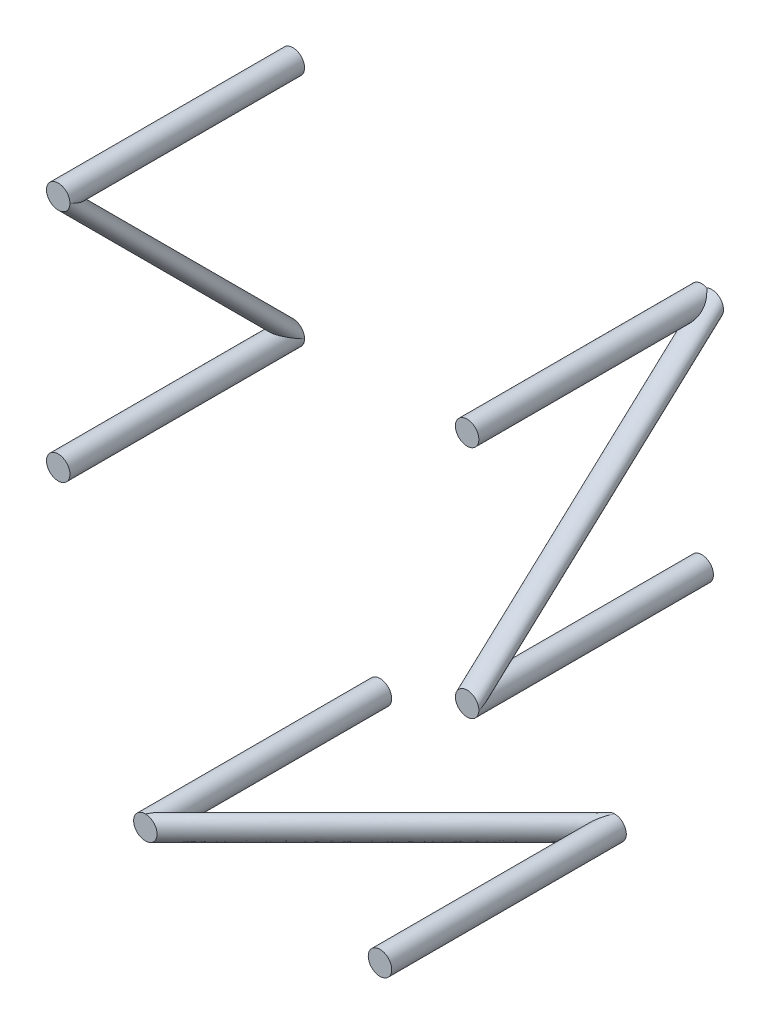
ISO-10303-21;
HEADER;
FILE_DESCRIPTION(('STEP AP214'),'2;1');
FILE_NAME('part.step','',(''),(''),'','','');
FILE_SCHEMA(('AUTOMOTIVE_DESIGN { 1 0 10303 214 1 1 1 1 }'));
ENDSEC;
DATA;
#1=APPLICATION_CONTEXT('core data for automotive mechanical design processes');
#2=APPLICATION_PROTOCOL_DEFINITION('international standard','automotive_design',2000,#1);
#3=PRODUCT_CONTEXT('',#1,'mechanical');
#4=PRODUCT('Part','Part','',(#3));
#5=PRODUCT_RELATED_PRODUCT_CATEGORY('part','',(#4));
#6=PRODUCT_DEFINITION_FORMATION('','',#4);
#7=PRODUCT_DEFINITION_CONTEXT('part definition',#1,'design');
#8=PRODUCT_DEFINITION('design','',#6,#7);
#9=PRODUCT_DEFINITION_SHAPE('','',#8);
#10=(LENGTH_UNIT() NAMED_UNIT(*) SI_UNIT(.MILLI.,.METRE.));
#11=(NAMED_UNIT(*) PLANE_ANGLE_UNIT() SI_UNIT($,.RADIAN.));
#12=(NAMED_UNIT(*) SI_UNIT($,.STERADIAN.) SOLID_ANGLE_UNIT());
#13=UNCERTAINTY_MEASURE_WITH_UNIT(LENGTH_MEASURE(1.E-05),#10,'distance_accuracy_value','');
#14=(GEOMETRIC_REPRESENTATION_CONTEXT(3) GLOBAL_UNCERTAINTY_ASSIGNED_CONTEXT((#13)) GLOBAL_UNIT_ASSIGNED_CONTEXT((#10,
#11,#12)) REPRESENTATION_CONTEXT('',''));
#15=CARTESIAN_POINT('',(0.,0.,0.));
#16=DIRECTION('',(0.,0.,1.));
#17=DIRECTION('',(1.,0.,0.));
#18=AXIS2_PLACEMENT_3D('',#15,#16,#17);
#19=CARTESIAN_POINT('',(61.,-35.,35.));
#20=DIRECTION('',(0.,0.,1.));
#21=DIRECTION('',(1.,0.,0.));
#22=AXIS2_PLACEMENT_3D('',#19,#20,#21);
#23=PLANE('',#22);
#24=CARTESIAN_POINT('',(61.,-35.,35.));
#25=DIRECTION('',(0.,0.,1.));
#26=DIRECTION('',(1.,0.,0.));
#27=AXIS2_PLACEMENT_3D('',#24,#25,#26);
#28=CIRCLE('',#27,3.50000000000001);
#29=CARTESIAN_POINT('',(64.5,-35.,35.));
#30=VERTEX_POINT('',#29);
#31=EDGE_CURVE('E50',#30,#30,#28,.T.);
#32=ORIENTED_EDGE('',*,*,#31,.T.);
#33=EDGE_LOOP('',(#32));
#34=FACE_BOUND('',#33,.T.);
#35=ADVANCED_FACE('F44',(#34),#23,.T.);
#36=CARTESIAN_POINT('',(64.0000000000002,35.,-35.));
#37=DIRECTION('',(0.,0.,1.));
#38=DIRECTION('',(1.,0.,0.));
#39=AXIS2_PLACEMENT_3D('',#36,#37,#38);
#40=PLANE('',#39);
#41=CARTESIAN_POINT('',(64.0000000000002,35.,-35.));
#42=DIRECTION('',(0.,0.,1.));
#43=DIRECTION('',(1.,0.,0.));
#44=AXIS2_PLACEMENT_3D('',#41,#42,#43);
#45=CIRCLE('',#44,3.50000000000001);
#46=CARTESIAN_POINT('',(67.5000000000002,35.,-35.));
#47=VERTEX_POINT('',#46);
#48=EDGE_CURVE('E11',#47,#47,#45,.T.);
#49=ORIENTED_EDGE('',*,*,#48,.F.);
#50=EDGE_LOOP('',(#49));
#51=FACE_BOUND('',#50,.T.);
#52=ADVANCED_FACE('F59',(#51),#40,.F.);
#53=CARTESIAN_POINT('',(64.5,-35.,35.));
#54=CARTESIAN_POINT('',(67.5000000000002,35.,-35.));
#55=CARTESIAN_POINT('',(64.5,-28.,35.));
#56=CARTESIAN_POINT('',(67.5000000000002,42.,-35.));
#57=CARTESIAN_POINT('',(57.5,-28.,35.));
#58=CARTESIAN_POINT('',(60.5000000000002,42.,-35.));
#59=CARTESIAN_POINT('',(57.5,-35.,35.));
#60=CARTESIAN_POINT('',(60.5000000000002,35.,-35.));
#61=CARTESIAN_POINT('',(57.5,-42.,35.));
#62=CARTESIAN_POINT('',(60.5000000000002,28.,-35.));
#63=CARTESIAN_POINT('',(64.5,-42.,35.));
#64=CARTESIAN_POINT('',(67.5000000000002,28.,-35.));
#65=CARTESIAN_POINT('',(64.5,-35.,35.));
#66=CARTESIAN_POINT('',(67.5000000000002,35.,-35.));
#67=(BOUNDED_SURFACE() B_SPLINE_SURFACE(3,1,((#53,#54),(#55,#56),(#57,#58),(#59,#60),(#61,#62),
(#63,#64),(#65,#66)),.UNSPECIFIED.,.T.,.F.,.F.) B_SPLINE_SURFACE_WITH_KNOTS((4,3,4),(2,2),(0.,
0.5,1.),(0.,1.),.UNSPECIFIED.) GEOMETRIC_REPRESENTATION_ITEM() RATIONAL_B_SPLINE_SURFACE(((1.,
1.),(0.333333333333333,0.333333333333333),(0.333333333333333,0.333333333333333),(1.,1.),
(0.333333333333333,0.333333333333333),(0.333333333333333,0.333333333333333),(1.,1.))) REPRESENTATION_ITEM('') SURFACE());
#68=CARTESIAN_POINT('',(67.5000000000002,35.,-35.));
#69=CARTESIAN_POINT('',(67.4687500000002,34.2708333333334,-34.2708333333333));
#70=CARTESIAN_POINT('',(67.4375000000002,33.5416666666667,-33.5416666666667));
#71=CARTESIAN_POINT('',(67.3750000000002,32.0833333333334,-32.0833333333333));
#72=CARTESIAN_POINT('',(67.3437500000002,31.3541666666667,-31.3541666666667));
#73=CARTESIAN_POINT('',(67.2812500000002,29.8958333333334,-29.8958333333333));
#74=CARTESIAN_POINT('',(67.2500000000002,29.1666666666667,-29.1666666666667));
#75=CARTESIAN_POINT('',(67.1875000000002,27.7083333333334,-27.7083333333333));
#76=CARTESIAN_POINT('',(67.1562500000002,26.9791666666667,-26.9791666666667));
#77=CARTESIAN_POINT('',(67.0937500000002,25.5208333333334,-25.5208333333333));
#78=CARTESIAN_POINT('',(67.0625000000002,24.7916666666667,-24.7916666666667));
#79=CARTESIAN_POINT('',(67.0000000000002,23.3333333333334,-23.3333333333333));
#80=CARTESIAN_POINT('',(66.9687500000002,22.6041666666667,-22.6041666666667));
#81=CARTESIAN_POINT('',(66.9062500000002,21.1458333333333,-21.1458333333333));
#82=CARTESIAN_POINT('',(66.8750000000002,20.4166666666667,-20.4166666666667));
#83=CARTESIAN_POINT('',(66.8125000000002,18.9583333333333,-18.9583333333333));
#84=CARTESIAN_POINT('',(66.7812500000002,18.2291666666667,-18.2291666666667));
#85=CARTESIAN_POINT('',(66.7187500000002,16.7708333333333,-16.7708333333333));
#86=CARTESIAN_POINT('',(66.6875000000002,16.0416666666667,-16.0416666666667));
#87=CARTESIAN_POINT('',(66.6250000000002,14.5833333333333,-14.5833333333333));
#88=CARTESIAN_POINT('',(66.5937500000002,13.8541666666667,-13.8541666666667));
#89=CARTESIAN_POINT('',(66.5312500000002,12.3958333333333,-12.3958333333333));
#90=CARTESIAN_POINT('',(66.5000000000002,11.6666666666667,-11.6666666666667));
#91=CARTESIAN_POINT('',(66.4375000000002,10.2083333333333,-10.2083333333333));
#92=CARTESIAN_POINT('',(66.4062500000002,9.47916666666667,-9.47916666666667));
#93=CARTESIAN_POINT('',(66.3437500000001,8.02083333333334,-8.02083333333333));
#94=CARTESIAN_POINT('',(66.3125000000001,7.29166666666667,-7.29166666666667));
#95=CARTESIAN_POINT('',(66.2500000000001,5.83333333333334,-5.83333333333333));
#96=CARTESIAN_POINT('',(66.2187500000001,5.10416666666667,-5.10416666666667));
#97=CARTESIAN_POINT('',(66.1562500000001,3.64583333333334,-3.64583333333334));
#98=CARTESIAN_POINT('',(66.1250000000001,2.91666666666667,-2.91666666666667));
#99=CARTESIAN_POINT('',(66.0625000000001,1.45833333333333,-1.45833333333333));
#100=CARTESIAN_POINT('',(66.0312500000001,0.729166666666667,-0.729166666666667));
#101=CARTESIAN_POINT('',(65.9687500000001,-0.729166666666667,0.729166666666667));
#102=CARTESIAN_POINT('',(65.9375000000001,-1.45833333333333,1.45833333333333));
#103=CARTESIAN_POINT('',(65.8750000000001,-2.91666666666667,2.91666666666667));
#104=CARTESIAN_POINT('',(65.8437500000001,-3.64583333333334,3.64583333333334));
#105=CARTESIAN_POINT('',(65.7812500000001,-5.10416666666667,5.10416666666667));
#106=CARTESIAN_POINT('',(65.7500000000001,-5.83333333333334,5.83333333333333));
#107=CARTESIAN_POINT('',(65.6875000000001,-7.29166666666667,7.29166666666667));
#108=CARTESIAN_POINT('',(65.6562500000001,-8.02083333333334,8.02083333333333));
#109=CARTESIAN_POINT('',(65.5937500000001,-9.47916666666667,9.47916666666667));
#110=CARTESIAN_POINT('',(65.5625000000001,-10.2083333333333,10.2083333333333));
#111=CARTESIAN_POINT('',(65.5000000000001,-11.6666666666667,11.6666666666667));
#112=CARTESIAN_POINT('',(65.4687500000001,-12.3958333333333,12.3958333333333));
#113=CARTESIAN_POINT('',(65.4062500000001,-13.8541666666667,13.8541666666667));
#114=CARTESIAN_POINT('',(65.3750000000001,-14.5833333333333,14.5833333333333));
#115=CARTESIAN_POINT('',(65.3125000000001,-16.0416666666667,16.0416666666667));
#116=CARTESIAN_POINT('',(65.2812500000001,-16.7708333333333,16.7708333333333));
#117=CARTESIAN_POINT('',(65.2187500000001,-18.2291666666667,18.2291666666667));
#118=CARTESIAN_POINT('',(65.1875000000001,-18.9583333333333,18.9583333333333));
#119=CARTESIAN_POINT('',(65.1250000000001,-20.4166666666667,20.4166666666667));
#120=CARTESIAN_POINT('',(65.0937500000001,-21.1458333333333,21.1458333333333));
#121=CARTESIAN_POINT('',(65.03125,-22.6041666666667,22.6041666666667));
#122=CARTESIAN_POINT('',(65.,-23.3333333333334,23.3333333333333));
#123=CARTESIAN_POINT('',(64.9375,-24.7916666666667,24.7916666666667));
#124=CARTESIAN_POINT('',(64.90625,-25.5208333333334,25.5208333333333));
#125=CARTESIAN_POINT('',(64.84375,-26.9791666666667,26.9791666666667));
#126=CARTESIAN_POINT('',(64.8125,-27.7083333333334,27.7083333333333));
#127=CARTESIAN_POINT('',(64.75,-29.1666666666667,29.1666666666667));
#128=CARTESIAN_POINT('',(64.71875,-29.8958333333334,29.8958333333333));
#129=CARTESIAN_POINT('',(64.65625,-31.3541666666667,31.3541666666667));
#130=CARTESIAN_POINT('',(64.625,-32.0833333333334,32.0833333333333));
#131=CARTESIAN_POINT('',(64.5625,-33.5416666666667,33.5416666666667));
#132=CARTESIAN_POINT('',(64.53125,-34.2708333333334,34.2708333333333));
#133=CARTESIAN_POINT('',(64.5,-35.,35.));
#134=B_SPLINE_CURVE_WITH_KNOTS('',3,(#68,#69,#70,#71,#72,#73,#74,#75,#76,#77,#78,#79,#80,#81,
#82,#83,#84,#85,#86,#87,#88,#89,#90,#91,#92,#93,#94,#95,#96,#97,#98,#99,#100,#101,#102,#103,
#104,#105,#106,#107,#108,#109,#110,#111,#112,#113,#114,#115,#116,#117,#118,#119,#120,#121,#122,
#123,#124,#125,#126,#127,#128,#129,#130,#131,#132,#133),.UNSPECIFIED.,.F.,.F.,(4,2,2,2,2,2,2,2,
2,2,2,2,2,2,2,2,2,2,2,2,2,2,2,2,2,2,2,2,2,2,2,2,4),(0.,3.09501236871519,6.19002473743038,
9.28503710614557,12.3800494748608,15.475061843576,18.5700742122911,21.6650865810063,
24.7600989497215,27.8551113184367,30.9501236871519,34.0451360558671,37.1401484245823,
40.2351607932975,43.3301731620127,46.4251855307278,49.520197899443,52.6152102681582,
55.7102226368734,58.8052350055886,61.9002473743038,64.995259743019,68.0902721117342,
71.1852844804494,74.2802968491646,77.3753092178797,80.4703215865949,83.5653339553101,
86.6603463240253,89.7553586927405,92.8503710614557,95.9453834301709,99.0403957988861),.UNSPECIFIED.);
#135=EDGE_CURVE('BSEAM57',#47,#30,#134,.T.);
#136=ORIENTED_EDGE('',*,*,#48,.T.);
#137=ORIENTED_EDGE('',*,*,#31,.F.);
#138=ORIENTED_EDGE('',*,*,#135,.T.);
#139=ORIENTED_EDGE('',*,*,#135,.F.);
#140=EDGE_LOOP('',(#136,#138,#137,#139));
#141=FACE_BOUND('',#140,.T.);
#142=ADVANCED_FACE('F57',(#141),#67,.F.);
#143=CLOSED_SHELL('',(#35,#52,#142));
#144=MANIFOLD_SOLID_BREP('B2',#143);
#145=CARTESIAN_POINT('',(-61.,35.,35.));
#146=DIRECTION('',(0.,0.,1.));
#147=DIRECTION('',(1.,0.,0.));
#148=AXIS2_PLACEMENT_3D('',#145,#146,#147);
#149=PLANE('',#148);
#150=CARTESIAN_POINT('',(-61.,35.,35.));
#151=DIRECTION('',(0.,0.,1.));
#152=DIRECTION('',(1.,0.,0.));
#153=AXIS2_PLACEMENT_3D('',#150,#151,#152);
#154=CIRCLE('',#153,3.5);
#155=CARTESIAN_POINT('',(-57.5,35.,35.));
#156=VERTEX_POINT('',#155);
#157=EDGE_CURVE('E106',#156,#156,#154,.T.);
#158=ORIENTED_EDGE('',*,*,#157,.T.);
#159=EDGE_LOOP('',(#158));
#160=FACE_BOUND('',#159,.T.);
#161=ADVANCED_FACE('F100',(#160),#149,.T.);
#162=CARTESIAN_POINT('',(-61.,-35.,-35.));
#163=DIRECTION('',(0.,0.,1.));
#164=DIRECTION('',(1.,0.,0.));
#165=AXIS2_PLACEMENT_3D('',#162,#163,#164);
#166=PLANE('',#165);
#167=CARTESIAN_POINT('',(-61.,-35.,-35.));
#168=DIRECTION('',(0.,0.,1.));
#169=DIRECTION('',(1.,0.,0.));
#170=AXIS2_PLACEMENT_3D('',#167,#168,#169);
#171=CIRCLE('',#170,3.5);
#172=CARTESIAN_POINT('',(-57.5,-35.,-35.));
#173=VERTEX_POINT('',#172);
#174=EDGE_CURVE('E43',#173,#173,#171,.T.);
#175=ORIENTED_EDGE('',*,*,#174,.F.);
#176=EDGE_LOOP('',(#175));
#177=FACE_BOUND('',#176,.T.);
#178=ADVANCED_FACE('F115',(#177),#166,.F.);
#179=CARTESIAN_POINT('',(-57.5,35.,35.));
#180=CARTESIAN_POINT('',(-57.5,-35.,-35.));
#181=CARTESIAN_POINT('',(-57.5,42.,35.));
#182=CARTESIAN_POINT('',(-57.5,-28.,-35.));
#183=CARTESIAN_POINT('',(-64.5,42.,35.));
#184=CARTESIAN_POINT('',(-64.5,-28.,-35.));
#185=CARTESIAN_POINT('',(-64.5,35.,35.));
#186=CARTESIAN_POINT('',(-64.5,-35.,-35.));
#187=CARTESIAN_POINT('',(-64.5,28.,35.));
#188=CARTESIAN_POINT('',(-64.5,-42.,-35.));
#189=CARTESIAN_POINT('',(-57.5,28.,35.));
#190=CARTESIAN_POINT('',(-57.5,-42.,-35.));
#191=CARTESIAN_POINT('',(-57.5,35.,35.));
#192=CARTESIAN_POINT('',(-57.5,-35.,-35.));
#193=(BOUNDED_SURFACE() B_SPLINE_SURFACE(3,1,((#179,#180),(#181,#182),(#183,#184),(#185,#186),
(#187,#188),(#189,#190),(#191,#192)),.UNSPECIFIED.,.T.,.F.,.F.) B_SPLINE_SURFACE_WITH_KNOTS((4,
3,4),(2,2),(0.,0.5,1.),(0.,1.),
.UNSPECIFIED.) GEOMETRIC_REPRESENTATION_ITEM() RATIONAL_B_SPLINE_SURFACE(((1.,1.),
(0.333333333333333,0.333333333333333),(0.333333333333333,0.333333333333333),(1.,1.),
(0.333333333333333,0.333333333333333),(0.333333333333333,0.333333333333333),(1.,1.))) REPRESENTATION_ITEM('') SURFACE());
#194=CARTESIAN_POINT('',(-57.5,-35.,-35.));
#195=CARTESIAN_POINT('',(-57.5,-34.2708333333334,-34.2708333333333));
#196=CARTESIAN_POINT('',(-57.5,-33.5416666666667,-33.5416666666667));
#197=CARTESIAN_POINT('',(-57.5,-32.0833333333333,-32.0833333333333));
#198=CARTESIAN_POINT('',(-57.5,-31.3541666666667,-31.3541666666667));
#199=CARTESIAN_POINT('',(-57.5,-29.8958333333333,-29.8958333333333));
#200=CARTESIAN_POINT('',(-57.5,-29.1666666666667,-29.1666666666667));
#201=CARTESIAN_POINT('',(-57.5,-27.7083333333333,-27.7083333333333));
#202=CARTESIAN_POINT('',(-57.5,-26.9791666666667,-26.9791666666667));
#203=CARTESIAN_POINT('',(-57.5,-25.5208333333333,-25.5208333333333));
#204=CARTESIAN_POINT('',(-57.5,-24.7916666666667,-24.7916666666667));
#205=CARTESIAN_POINT('',(-57.5,-23.3333333333333,-23.3333333333333));
#206=CARTESIAN_POINT('',(-57.5,-22.6041666666667,-22.6041666666667));
#207=CARTESIAN_POINT('',(-57.5,-21.1458333333333,-21.1458333333333));
#208=CARTESIAN_POINT('',(-57.5,-20.4166666666667,-20.4166666666667));
#209=CARTESIAN_POINT('',(-57.5,-18.9583333333333,-18.9583333333333));
#210=CARTESIAN_POINT('',(-57.5,-18.2291666666667,-18.2291666666667));
#211=CARTESIAN_POINT('',(-57.5,-16.7708333333333,-16.7708333333333));
#212=CARTESIAN_POINT('',(-57.5,-16.0416666666667,-16.0416666666667));
#213=CARTESIAN_POINT('',(-57.5,-14.5833333333333,-14.5833333333333));
#214=CARTESIAN_POINT('',(-57.5,-13.8541666666667,-13.8541666666667));
#215=CARTESIAN_POINT('',(-57.5,-12.3958333333333,-12.3958333333333));
#216=CARTESIAN_POINT('',(-57.5,-11.6666666666667,-11.6666666666667));
#217=CARTESIAN_POINT('',(-57.5,-10.2083333333333,-10.2083333333333));
#218=CARTESIAN_POINT('',(-57.5,-9.47916666666667,-9.47916666666666));
#219=CARTESIAN_POINT('',(-57.5,-8.02083333333333,-8.02083333333333));
#220=CARTESIAN_POINT('',(-57.5,-7.29166666666667,-7.29166666666666));
#221=CARTESIAN_POINT('',(-57.5,-5.83333333333333,-5.83333333333333));
#222=CARTESIAN_POINT('',(-57.5,-5.10416666666667,-5.10416666666666));
#223=CARTESIAN_POINT('',(-57.5,-3.64583333333333,-3.64583333333333));
#224=CARTESIAN_POINT('',(-57.5,-2.91666666666666,-2.91666666666666));
#225=CARTESIAN_POINT('',(-57.5,-1.45833333333333,-1.45833333333333));
#226=CARTESIAN_POINT('',(-57.5,-0.72916666666666,-0.729166666666661));
#227=CARTESIAN_POINT('',(-57.5,0.729166666666674,0.729166666666675));
#228=CARTESIAN_POINT('',(-57.5,1.45833333333334,1.45833333333334));
#229=CARTESIAN_POINT('',(-57.5,2.91666666666668,2.91666666666667));
#230=CARTESIAN_POINT('',(-57.5,3.64583333333334,3.64583333333334));
#231=CARTESIAN_POINT('',(-57.5,5.10416666666668,5.10416666666667));
#232=CARTESIAN_POINT('',(-57.5,5.83333333333334,5.83333333333334));
#233=CARTESIAN_POINT('',(-57.5,7.29166666666668,7.29166666666667));
#234=CARTESIAN_POINT('',(-57.5,8.02083333333334,8.02083333333334));
#235=CARTESIAN_POINT('',(-57.5,9.47916666666668,9.47916666666667));
#236=CARTESIAN_POINT('',(-57.5,10.2083333333333,10.2083333333333));
#237=CARTESIAN_POINT('',(-57.5,11.6666666666667,11.6666666666667));
#238=CARTESIAN_POINT('',(-57.5,12.3958333333333,12.3958333333333));
#239=CARTESIAN_POINT('',(-57.5,13.8541666666667,13.8541666666667));
#240=CARTESIAN_POINT('',(-57.5,14.5833333333334,14.5833333333333));
#241=CARTESIAN_POINT('',(-57.5,16.0416666666667,16.0416666666667));
#242=CARTESIAN_POINT('',(-57.5,16.7708333333334,16.7708333333333));
#243=CARTESIAN_POINT('',(-57.5,18.2291666666667,18.2291666666667));
#244=CARTESIAN_POINT('',(-57.5,18.9583333333334,18.9583333333333));
#245=CARTESIAN_POINT('',(-57.5,20.4166666666667,20.4166666666667));
#246=CARTESIAN_POINT('',(-57.5,21.1458333333334,21.1458333333333));
#247=CARTESIAN_POINT('',(-57.5,22.6041666666667,22.6041666666667));
#248=CARTESIAN_POINT('',(-57.5,23.3333333333334,23.3333333333333));
#249=CARTESIAN_POINT('',(-57.5,24.7916666666667,24.7916666666667));
#250=CARTESIAN_POINT('',(-57.5,25.5208333333334,25.5208333333333));
#251=CARTESIAN_POINT('',(-57.5,26.9791666666667,26.9791666666667));
#252=CARTESIAN_POINT('',(-57.5,27.7083333333334,27.7083333333333));
#253=CARTESIAN_POINT('',(-57.5,29.1666666666667,29.1666666666667));
#254=CARTESIAN_POINT('',(-57.5,29.8958333333334,29.8958333333333));
#255=CARTESIAN_POINT('',(-57.5,31.3541666666667,31.3541666666667));
#256=CARTESIAN_POINT('',(-57.5,32.0833333333334,32.0833333333333));
#257=CARTESIAN_POINT('',(-57.5,33.5416666666667,33.5416666666667));
#258=CARTESIAN_POINT('',(-57.5,34.2708333333334,34.2708333333333));
#259=CARTESIAN_POINT('',(-57.5,35.,35.));
#260=B_SPLINE_CURVE_WITH_KNOTS('',3,(#194,#195,#196,#197,#198,#199,#200,#201,#202,#203,#204,
#205,#206,#207,#208,#209,#210,#211,#212,#213,#214,#215,#216,#217,#218,#219,#220,#221,#222,#223,
#224,#225,#226,#227,#228,#229,#230,#231,#232,#233,#234,#235,#236,#237,#238,#239,#240,#241,#242,
#243,#244,#245,#246,#247,#248,#249,#250,#251,#252,#253,#254,#255,#256,#257,#258,#259),
.UNSPECIFIED.,.F.,.F.,(4,2,2,2,2,2,2,2,2,2,2,2,2,2,2,2,2,2,2,2,2,2,2,2,2,2,2,2,2,2,2,2,4),(0.,
3.09359216769114,6.1871843353823,9.28077650307344,12.3743686707646,15.4679608384557,
18.5615530061469,21.655145173838,24.7487373415292,27.8423295092203,30.9359216769115,
34.0295138446026,37.1231060122938,40.2166981799849,43.310290347676,46.4038825153672,
49.4974746830583,52.5910668507495,55.6846590184406,58.7782511861318,61.8718433538229,
64.9654355215141,68.0590276892052,71.1526198568964,74.2462120245875,77.3398041922786,
80.4333963599698,83.5269885276609,86.6205806953521,89.7141728630432,92.8077650307344,
95.9013571984255,98.9949493661166),.UNSPECIFIED.);
#261=EDGE_CURVE('BSEAM113',#173,#156,#260,.T.);
#262=ORIENTED_EDGE('',*,*,#174,.T.);
#263=ORIENTED_EDGE('',*,*,#157,.F.);
#264=ORIENTED_EDGE('',*,*,#261,.T.);
#265=ORIENTED_EDGE('',*,*,#261,.F.);
#266=EDGE_LOOP('',(#262,#264,#263,#265));
#267=FACE_BOUND('',#266,.T.);
#268=ADVANCED_FACE('F113',(#267),#193,.F.);
#269=CLOSED_SHELL('',(#161,#178,#268));
#270=MANIFOLD_SOLID_BREP('B6',#269);
#271=CARTESIAN_POINT('',(61.,35.,-35.));
#272=DIRECTION('',(0.,0.,1.));
#273=DIRECTION('',(1.,0.,0.));
#274=AXIS2_PLACEMENT_3D('',#271,#272,#273);
#275=CYLINDRICAL_SURFACE('',#274,3.50000000000002);
#276=CARTESIAN_POINT('',(61.,35.,-35.));
#277=DIRECTION('',(0.,0.,1.));
#278=DIRECTION('',(-1.,0.,0.));
#279=AXIS2_PLACEMENT_3D('',#276,#277,#278);
#280=CIRCLE('',#279,3.50000000000002);
#281=CARTESIAN_POINT('',(57.5,35.,-35.));
#282=VERTEX_POINT('',#281);
#283=EDGE_CURVE('E99',#282,#282,#280,.T.);
#284=ORIENTED_EDGE('',*,*,#283,.T.);
#285=EDGE_LOOP('',(#284));
#286=FACE_BOUND('',#285,.T.);
#287=CARTESIAN_POINT('',(61.,35.,35.));
#288=DIRECTION('',(0.,0.,1.));
#289=DIRECTION('',(-1.,0.,0.));
#290=AXIS2_PLACEMENT_3D('',#287,#288,#289);
#291=CIRCLE('',#290,3.50000000000002);
#292=CARTESIAN_POINT('',(57.5,35.,35.));
#293=VERTEX_POINT('',#292);
#294=EDGE_CURVE('E162',#293,#293,#291,.T.);
#295=ORIENTED_EDGE('',*,*,#294,.F.);
#296=EDGE_LOOP('',(#295));
#297=FACE_BOUND('',#296,.T.);
#298=ADVANCED_FACE('F156',(#286,#297),#275,.T.);
#299=CARTESIAN_POINT('',(61.,35.,-35.));
#300=DIRECTION('',(0.,0.,-1.));
#301=DIRECTION('',(-1.,0.,0.));
#302=AXIS2_PLACEMENT_3D('',#299,#300,#301);
#303=PLANE('',#302);
#304=ORIENTED_EDGE('',*,*,#283,.F.);
#305=EDGE_LOOP('',(#304));
#306=FACE_BOUND('',#305,.T.);
#307=ADVANCED_FACE('F171',(#306),#303,.T.);
#308=CARTESIAN_POINT('',(61.,35.,35.));
#309=DIRECTION('',(0.,0.,-1.));
#310=DIRECTION('',(-1.,0.,0.));
#311=AXIS2_PLACEMENT_3D('',#308,#309,#310);
#312=PLANE('',#311);
#313=ORIENTED_EDGE('',*,*,#294,.T.);
#314=EDGE_LOOP('',(#313));
#315=FACE_BOUND('',#314,.T.);
#316=ADVANCED_FACE('F168',(#315),#312,.F.);
#317=CLOSED_SHELL('',(#298,#307,#316));
#318=MANIFOLD_SOLID_BREP('B38',#317);
#319=CARTESIAN_POINT('',(61.,-35.,-35.));
#320=DIRECTION('',(0.,0.,1.));
#321=DIRECTION('',(1.,0.,0.));
#322=AXIS2_PLACEMENT_3D('',#319,#320,#321);
#323=CYLINDRICAL_SURFACE('',#322,3.50000000000001);
#324=CARTESIAN_POINT('',(61.,-35.,-35.));
#325=DIRECTION('',(0.,0.,1.));
#326=DIRECTION('',(1.,0.,0.));
#327=AXIS2_PLACEMENT_3D('',#324,#325,#326);
#328=CIRCLE('',#327,3.50000000000001);
#329=CARTESIAN_POINT('',(64.5,-35.,-35.));
#330=VERTEX_POINT('',#329);
#331=EDGE_CURVE('E155',#330,#330,#328,.T.);
#332=ORIENTED_EDGE('',*,*,#331,.T.);
#333=EDGE_LOOP('',(#332));
#334=FACE_BOUND('',#333,.T.);
#335=CARTESIAN_POINT('',(61.,-35.,35.));
#336=DIRECTION('',(0.,0.,1.));
#337=DIRECTION('',(1.,0.,0.));
#338=AXIS2_PLACEMENT_3D('',#335,#336,#337);
#339=CIRCLE('',#338,3.50000000000001);
#340=CARTESIAN_POINT('',(64.5,-35.,35.));
#341=VERTEX_POINT('',#340);
#342=EDGE_CURVE('E213',#341,#341,#339,.T.);
#343=ORIENTED_EDGE('',*,*,#342,.F.);
#344=EDGE_LOOP('',(#343));
#345=FACE_BOUND('',#344,.T.);
#346=ADVANCED_FACE('F207',(#334,#345),#323,.T.);
#347=CARTESIAN_POINT('',(61.,-35.,-35.));
#348=DIRECTION('',(0.,0.,1.));
#349=DIRECTION('',(1.,0.,0.));
#350=AXIS2_PLACEMENT_3D('',#347,#348,#349);
#351=PLANE('',#350);
#352=ORIENTED_EDGE('',*,*,#331,.F.);
#353=EDGE_LOOP('',(#352));
#354=FACE_BOUND('',#353,.T.);
#355=ADVANCED_FACE('F222',(#354),#351,.F.);
#356=CARTESIAN_POINT('',(61.,-35.,35.));
#357=DIRECTION('',(0.,0.,1.));
#358=DIRECTION('',(1.,0.,0.));
#359=AXIS2_PLACEMENT_3D('',#356,#357,#358);
#360=PLANE('',#359);
#361=ORIENTED_EDGE('',*,*,#342,.T.);
#362=EDGE_LOOP('',(#361));
#363=FACE_BOUND('',#362,.T.);
#364=ADVANCED_FACE('F219',(#363),#360,.T.);
#365=CLOSED_SHELL('',(#346,#355,#364));
#366=MANIFOLD_SOLID_BREP('B94',#365);
#367=CARTESIAN_POINT('',(-35.,-115.,-35.));
#368=DIRECTION('',(0.,0.,1.));
#369=DIRECTION('',(1.,0.,0.));
#370=AXIS2_PLACEMENT_3D('',#367,#368,#369);
#371=CYLINDRICAL_SURFACE('',#370,3.5);
#372=CARTESIAN_POINT('',(-35.,-115.,-35.));
#373=DIRECTION('',(0.,0.,1.));
#374=DIRECTION('',(1.,0.,0.));
#375=AXIS2_PLACEMENT_3D('',#372,#373,#374);
#376=CIRCLE('',#375,3.5);
#377=CARTESIAN_POINT('',(-31.5,-115.,-35.));
#378=VERTEX_POINT('',#377);
#379=EDGE_CURVE('E271',#378,#378,#376,.T.);
#380=ORIENTED_EDGE('',*,*,#379,.T.);
#381=EDGE_LOOP('',(#380));
#382=FACE_BOUND('',#381,.T.);
#383=CARTESIAN_POINT('',(-35.,-115.,35.));
#384=DIRECTION('',(0.,0.,1.));
#385=DIRECTION('',(1.,0.,0.));
#386=AXIS2_PLACEMENT_3D('',#383,#384,#385);
#387=CIRCLE('',#386,3.5);
#388=CARTESIAN_POINT('',(-35.,-111.5,35.));
#389=VERTEX_POINT('',#388);
#390=CARTESIAN_POINT('',(-35.,-118.5,35.));
#391=VERTEX_POINT('',#390);
#392=EDGE_CURVE('E340',#389,#391,#387,.T.);
#393=ORIENTED_EDGE('',*,*,#392,.F.);
#394=CARTESIAN_POINT('',(-35.,-111.5,35.));
#395=CARTESIAN_POINT('',(-34.9977563749342,-111.500000004722,34.9955127498663));
#396=CARTESIAN_POINT('',(-34.9955127428364,-111.500002161927,34.9910254856688));
#397=CARTESIAN_POINT('',(-34.8620484832201,-111.50025855784,34.7240969663212));
#398=CARTESIAN_POINT('',(-34.7308071772539,-111.507875167255,34.4616143544757));
#399=CARTESIAN_POINT('',(-34.468632762601,-111.53805382394,33.9372655252337));
#400=CARTESIAN_POINT('',(-34.3376997735933,-111.560620941264,33.6753995471951));
#401=CARTESIAN_POINT('',(-34.0762233281079,-111.621435072747,33.1524466562073));
#402=CARTESIAN_POINT('',(-33.9456816643011,-111.659721153183,32.8913633286001));
#403=CARTESIAN_POINT('',(-33.6858316696154,-111.753149661585,32.3716633392329));
#404=CARTESIAN_POINT('',(-33.5565229725652,-111.808286913364,32.1130459451303));
#405=CARTESIAN_POINT('',(-33.3282783326159,-111.923016150736,31.656556665232));
#406=CARTESIAN_POINT('',(-33.2289709009707,-111.978903499793,31.4579418019433));
#407=CARTESIAN_POINT('',(-33.0319123408711,-112.10341064522,31.0638246817404));
#408=CARTESIAN_POINT('',(-32.934161796042,-112.172035099755,30.8683235920769));
#409=CARTESIAN_POINT('',(-32.7413347348131,-112.323542151783,30.4826694696336));
#410=CARTESIAN_POINT('',(-32.6462483032511,-112.406360341195,30.2924966065292));
#411=CARTESIAN_POINT('',(-32.5061693211741,-112.543366271064,30.0123386423348));
#412=CARTESIAN_POINT('',(-32.4599165776625,-112.591146458485,29.9198331552866));
#413=CARTESIAN_POINT('',(-32.368448345756,-112.691418790247,29.7368966914763));
#414=CARTESIAN_POINT('',(-32.3232326318008,-112.743909897495,29.6464652635937));
#415=CARTESIAN_POINT('',(-32.2465832194559,-112.838681793444,29.4931664389179));
#416=CARTESIAN_POINT('',(-32.2148382064654,-112.87970161789,29.4296764129324));
#417=CARTESIAN_POINT('',(-32.1521509575391,-112.964677017996,29.3043019150767));
#418=CARTESIAN_POINT('',(-32.1212086872331,-113.008632467674,29.2424173744657));
#419=CARTESIAN_POINT('',(-32.0296850490348,-113.145457951283,29.0593700980708));
#420=CARTESIAN_POINT('',(-31.9704987302701,-113.243175955465,28.9409974605405));
#421=CARTESIAN_POINT('',(-31.8856688625703,-113.401700090203,28.7713377251405));
#422=CARTESIAN_POINT('',(-31.8579112033267,-113.456864267998,28.7158224066534));
#423=CARTESIAN_POINT('',(-31.8041993266576,-113.571409454089,28.6083986533153));
#424=CARTESIAN_POINT('',(-31.7782455167566,-113.630791409176,28.5564910335133));
#425=CARTESIAN_POINT('',(-31.7038541802641,-113.8155196526,28.4077083605283));
#426=CARTESIAN_POINT('',(-31.6586565620006,-113.947860578282,28.3173131240013));
#427=CARTESIAN_POINT('',(-31.5974213047136,-114.175196341618,28.1948426094273));
#428=CARTESIAN_POINT('',(-31.576927295035,-114.264193876803,28.1538545900701));
#429=CARTESIAN_POINT('',(-31.5424984426288,-114.448289871332,28.0849968852577));
#430=CARTESIAN_POINT('',(-31.5285478773462,-114.54337307618,28.0570957546926));
#431=CARTESIAN_POINT('',(-31.5124323930308,-114.699335835539,28.0248647860617));
#432=CARTESIAN_POINT('',(-31.5077903111709,-114.758969212717,28.0155806223418));
#433=CARTESIAN_POINT('',(-31.5015741346669,-114.879071474249,28.0031482693338));
#434=CARTESIAN_POINT('',(-31.5000008216721,-114.939540567522,28.0000016433443));
#435=CARTESIAN_POINT('',(-31.4999992946078,-115.051903441553,27.9999985892157));
#436=CARTESIAN_POINT('',(-31.5011575064895,-115.103799763155,28.002315012979));
#437=CARTESIAN_POINT('',(-31.5057503758902,-115.20710638695,28.0115007517806));
#438=CARTESIAN_POINT('',(-31.5091859422573,-115.258516486789,28.0183718845149));
#439=CARTESIAN_POINT('',(-31.5182326130715,-115.36044070367,28.0364652261428));
#440=CARTESIAN_POINT('',(-31.5238468113603,-115.410953439217,28.0476936227192));
#441=CARTESIAN_POINT('',(-31.5370869047974,-115.510653371325,28.0741738095933));
#442=CARTESIAN_POINT('',(-31.5447138465577,-115.559839863541,28.089427693115));
#443=CARTESIAN_POINT('',(-31.5701308405758,-115.703853184053,28.1402616811527));
#444=CARTESIAN_POINT('',(-31.590575104127,-115.796373849734,28.1811502082541));
#445=CARTESIAN_POINT('',(-31.6369956129912,-115.973993801718,28.2739912259823));
#446=CARTESIAN_POINT('',(-31.6629728594051,-116.05909174107,28.3259457188107));
#447=CARTESIAN_POINT('',(-31.7162576503877,-116.213679540623,28.432515300775));
#448=CARTESIAN_POINT('',(-31.7431609098812,-116.283876502937,28.4863218197605));
#449=CARTESIAN_POINT('',(-31.7996169360317,-116.418767028603,28.5992338720652));
#450=CARTESIAN_POINT('',(-31.8291716063018,-116.483456571833,28.6583432126107));
#451=CARTESIAN_POINT('',(-31.8904233804069,-116.607904440383,28.7808467608067));
#452=CARTESIAN_POINT('',(-31.9221261851982,-116.66764862809,28.8442523703699));
#453=CARTESIAN_POINT('',(-31.9871801637954,-116.782489173027,28.9743603275631));
#454=CARTESIAN_POINT('',(-32.0205319876865,-116.837583673686,29.0410639753635));
#455=CARTESIAN_POINT('',(-32.1204160987328,-116.993216659291,29.2408321974841));
#456=CARTESIAN_POINT('',(-32.1887572316225,-117.087966114413,29.3775144632499));
#457=CARTESIAN_POINT('',(-32.3287641129938,-117.264323829647,29.6575282259827));
#458=CARTESIAN_POINT('',(-32.4004330293436,-117.345919223203,29.8008660586859));
#459=CARTESIAN_POINT('',(-32.546191968603,-117.497984273715,30.0923839372073));
#460=CARTESIAN_POINT('',(-32.6202850812771,-117.568439007068,30.2405701625541));
#461=CARTESIAN_POINT('',(-32.7701364703684,-117.699557436975,30.5402729407369));
#462=CARTESIAN_POINT('',(-32.8458941437376,-117.760224615082,30.6917882874766));
#463=CARTESIAN_POINT('',(-33.0044205218316,-117.877165068571,31.0088410436617));
#464=CARTESIAN_POINT('',(-33.0872880421466,-117.932764843156,31.1745760842872));
#465=CARTESIAN_POINT('',(-33.2541183709089,-118.035039859133,31.5082367418237));
#466=CARTESIAN_POINT('',(-33.3380813004782,-118.081714104519,31.6761626009787));
#467=CARTESIAN_POINT('',(-33.5066877208864,-118.166847130037,32.0133754417504));
#468=CARTESIAN_POINT('',(-33.5913298807729,-118.20531916517,32.1826597614622));
#469=CARTESIAN_POINT('',(-33.7612355775637,-118.274734102172,32.5224711550488));
#470=CARTESIAN_POINT('',(-33.846499185948,-118.30567612339,32.6929983718836));
#471=CARTESIAN_POINT('',(-34.0195983307745,-118.361142094674,33.039196661562));
#472=CARTESIAN_POINT('',(-34.1074452686941,-118.385488125727,33.2148905373577));
#473=CARTESIAN_POINT('',(-34.2834768903887,-118.427064149348,33.5669537807462));
#474=CARTESIAN_POINT('',(-34.3716616133893,-118.444293288517,33.7433232267901));
#475=CARTESIAN_POINT('',(-34.6374359261832,-118.485807887077,34.2748718523436));
#476=CARTESIAN_POINT('',(-34.8153908747437,-118.499652190582,34.6307817492237));
#477=CARTESIAN_POINT('',(-34.995512749044,-118.499997833272,34.9910254980813));
#478=CARTESIAN_POINT('',(-34.997756381189,-118.499999990403,34.9955127623747));
#479=CARTESIAN_POINT('',(-35.,-118.5,35.));
#480=B_SPLINE_CURVE_WITH_KNOTS('',3,(#394,#395,#396,#397,#398,#399,#400,#401,#402,#403,#404,
#405,#406,#407,#408,#409,#410,#411,#412,#413,#414,#415,#416,#417,#418,#419,#420,#421,#422,#423,
#424,#425,#426,#427,#428,#429,#430,#431,#432,#433,#434,#435,#436,#437,#438,#439,#440,#441,#442,
#443,#444,#445,#446,#447,#448,#449,#450,#451,#452,#453,#454,#455,#456,#457,#458,#459,#460,#461,
#462,#463,#464,#465,#466,#467,#468,#469,#470,#471,#472,#473,#474,#475,#476,#477,#478,#479),
.UNSPECIFIED.,.F.,.F.,(4,2,2,2,2,2,2,2,2,2,2,2,2,2,2,2,2,2,2,2,2,2,2,2,2,2,2,2,2,2,2,2,2,2,2,2,
2,2,2,2,2,2,4),(0.,0.0150507408559474,0.895303010266596,1.77585394595171,2.65860668766958,
3.54108854563516,4.22771124357415,4.91458554704388,5.59842172140305,5.94010986653757,
6.28172297375374,6.52760343233749,6.77347334583262,7.26591182090168,7.51484057249998,
7.76382538034507,8.25983354398801,8.55917878754933,8.85780103392816,9.03904480376667,
9.22033473236947,9.37596919381985,9.53166580339506,9.68758432924464,9.84358409190497,
10.1518311324932,10.4601339926846,10.7370678204758,11.0142020923461,11.2921030717519,
11.5701144941611,12.1086167488615,12.6476425811839,13.1873844642821,13.7269339292061,
14.3070576732455,14.8872461159579,15.4664897292416,16.0458010539106,16.6394589198613,
17.2331879516688,18.4264248129088,18.4414755537647),.UNSPECIFIED.);
#481=EDGE_CURVE('E284',#389,#391,#480,.T.);
#482=ORIENTED_EDGE('',*,*,#481,.T.);
#483=EDGE_LOOP('',(#393,#482));
#484=FACE_BOUND('',#483,.T.);
#485=ADVANCED_FACE('F256',(#382,#484),#371,.T.);
#486=CARTESIAN_POINT('',(-35.,-115.,-35.));
#487=DIRECTION('',(0.,0.,1.));
#488=DIRECTION('',(1.,0.,0.));
#489=AXIS2_PLACEMENT_3D('',#486,#487,#488);
#490=PLANE('',#489);
#491=ORIENTED_EDGE('',*,*,#379,.F.);
#492=EDGE_LOOP('',(#491));
#493=FACE_BOUND('',#492,.T.);
#494=ADVANCED_FACE('F330',(#493),#490,.F.);
#495=CARTESIAN_POINT('',(-35.,-115.,35.));
#496=DIRECTION('',(0.,0.,1.));
#497=DIRECTION('',(1.,0.,0.));
#498=AXIS2_PLACEMENT_3D('',#495,#496,#497);
#499=PLANE('',#498);
#500=ORIENTED_EDGE('',*,*,#392,.T.);
#501=EDGE_CURVE('E305',#391,#389,#387,.T.);
#502=ORIENTED_EDGE('',*,*,#501,.T.);
#503=EDGE_LOOP('',(#500,#502));
#504=FACE_BOUND('',#503,.T.);
#505=ADVANCED_FACE('F318',(#504),#499,.T.);
#506=CARTESIAN_POINT('',(35.0000000000008,-115.,-35.));
#507=DIRECTION('',(0.,0.,1.));
#508=DIRECTION('',(1.,0.,0.));
#509=AXIS2_PLACEMENT_3D('',#506,#507,#508);
#510=PLANE('',#509);
#511=CARTESIAN_POINT('',(35.0000000000008,-115.,-35.));
#512=DIRECTION('',(0.,0.,1.));
#513=DIRECTION('',(1.,0.,0.));
#514=AXIS2_PLACEMENT_3D('',#511,#512,#513);
#515=CIRCLE('',#514,3.50000000000001);
#516=CARTESIAN_POINT('',(35.0000000000008,-111.5,-35.));
#517=VERTEX_POINT('',#516);
#518=CARTESIAN_POINT('',(35.0000000000008,-118.5,-35.));
#519=VERTEX_POINT('',#518);
#520=EDGE_CURVE('E289',#517,#519,#515,.T.);
#521=ORIENTED_EDGE('',*,*,#520,.F.);
#522=CARTESIAN_POINT('',(35.0000000000008,-115.,-35.));
#523=DIRECTION('',(0.,0.,1.));
#524=DIRECTION('',(-1.,0.,0.));
#525=AXIS2_PLACEMENT_3D('',#522,#523,#524);
#526=CIRCLE('',#525,3.5);
#527=EDGE_CURVE('E277',#519,#517,#526,.T.);
#528=ORIENTED_EDGE('',*,*,#527,.F.);
#529=EDGE_LOOP('',(#521,#528));
#530=FACE_BOUND('',#529,.T.);
#531=ADVANCED_FACE('F290',(#530),#510,.F.);
#532=CARTESIAN_POINT('',(-31.5,-115.,35.));
#533=CARTESIAN_POINT('',(38.5000000000008,-115.,-35.));
#534=CARTESIAN_POINT('',(-31.5,-108.,35.));
#535=CARTESIAN_POINT('',(38.5000000000008,-108.,-35.));
#536=CARTESIAN_POINT('',(-38.5,-108.,35.));
#537=CARTESIAN_POINT('',(31.5000000000008,-108.,-35.));
#538=CARTESIAN_POINT('',(-38.5,-115.,35.));
#539=CARTESIAN_POINT('',(31.5000000000008,-115.,-35.));
#540=CARTESIAN_POINT('',(-38.5,-122.,35.));
#541=CARTESIAN_POINT('',(31.5000000000008,-122.,-35.));
#542=CARTESIAN_POINT('',(-31.5,-122.,35.));
#543=CARTESIAN_POINT('',(38.5000000000008,-122.,-35.));
#544=CARTESIAN_POINT('',(-31.5,-115.,35.));
#545=CARTESIAN_POINT('',(38.5000000000008,-115.,-35.));
#546=(BOUNDED_SURFACE() B_SPLINE_SURFACE(3,1,((#532,#533),(#534,#535),(#536,#537),(#538,#539),
(#540,#541),(#542,#543),(#544,#545)),.UNSPECIFIED.,.T.,.F.,.F.) B_SPLINE_SURFACE_WITH_KNOTS((4,
3,4),(2,2),(0.,0.5,1.),(0.,1.),
.UNSPECIFIED.) GEOMETRIC_REPRESENTATION_ITEM() RATIONAL_B_SPLINE_SURFACE(((1.,1.),
(0.333333333333333,0.333333333333333),(0.333333333333333,0.333333333333333),(1.,1.),
(0.333333333333333,0.333333333333333),(0.333333333333333,0.333333333333333),(1.,1.))) REPRESENTATION_ITEM('') SURFACE());
#547=CARTESIAN_POINT('',(35.0000000000008,-118.5,-35.));
#548=CARTESIAN_POINT('',(34.9977563749363,-118.499999995278,-34.9955127498656));
#549=CARTESIAN_POINT('',(34.9955127428399,-118.499997838073,-34.9910254856675));
#550=CARTESIAN_POINT('',(34.8620484832992,-118.49974144216,-34.724096966282));
#551=CARTESIAN_POINT('',(34.7308071772755,-118.492124832745,-34.4616143544652));
#552=CARTESIAN_POINT('',(34.4686327625806,-118.46194617606,-33.9372655252442));
#553=CARTESIAN_POINT('',(34.3376997735884,-118.439379058736,-33.6753995471978));
#554=CARTESIAN_POINT('',(34.0762233281144,-118.378564927253,-33.1524466562044));
#555=CARTESIAN_POINT('',(33.9456816643034,-118.340278846817,-32.8913633285993));
#556=CARTESIAN_POINT('',(33.6858316696147,-118.246850338415,-32.3716633392335));
#557=CARTESIAN_POINT('',(33.5565229725657,-118.191713086636,-32.1130459451304));
#558=CARTESIAN_POINT('',(33.328278332617,-118.076983849264,-31.6565566652318));
#559=CARTESIAN_POINT('',(33.2289709009716,-118.021096500208,-31.4579418019433));
#560=CARTESIAN_POINT('',(33.0319123408718,-117.89658935478,-31.0638246817405));
#561=CARTESIAN_POINT('',(32.9341617960428,-117.827964900245,-30.868323592077));
#562=CARTESIAN_POINT('',(32.741334734814,-117.676457848217,-30.4826694696337));
#563=CARTESIAN_POINT('',(32.646248303252,-117.593639658805,-30.2924966065292));
#564=CARTESIAN_POINT('',(32.5061693211749,-117.456633728936,-30.0123386423349));
#565=CARTESIAN_POINT('',(32.4599165776633,-117.408853541515,-29.9198331552867));
#566=CARTESIAN_POINT('',(32.3684483457568,-117.308581209753,-29.7368966914764));
#567=CARTESIAN_POINT('',(32.3232326318016,-117.256090102505,-29.6464652635937));
#568=CARTESIAN_POINT('',(32.2465832194568,-117.161318206557,-29.493166438918));
#569=CARTESIAN_POINT('',(32.2148382064662,-117.12029838211,-29.4296764129325));
#570=CARTESIAN_POINT('',(32.15215095754,-117.035322982004,-29.3043019150768));
#571=CARTESIAN_POINT('',(32.1212086872339,-116.991367532326,-29.2424173744658));
#572=CARTESIAN_POINT('',(32.0296850490356,-116.854542048717,-29.0593700980708));
#573=CARTESIAN_POINT('',(31.9704987302709,-116.756824044535,-28.9409974605405));
#574=CARTESIAN_POINT('',(31.8856688625711,-116.598299909797,-28.7713377251406));
#575=CARTESIAN_POINT('',(31.8579112033275,-116.543135732002,-28.7158224066534));
#576=CARTESIAN_POINT('',(31.8041993266584,-116.428590545911,-28.6083986533153));
#577=CARTESIAN_POINT('',(31.7782455167574,-116.369208590825,-28.5564910335133));
#578=CARTESIAN_POINT('',(31.7038541802649,-116.184480347401,-28.4077083605283));
#579=CARTESIAN_POINT('',(31.6586565620014,-116.052139421718,-28.3173131240013));
#580=CARTESIAN_POINT('',(31.5974213047144,-115.824803658382,-28.1948426094273));
#581=CARTESIAN_POINT('',(31.5769272950358,-115.735806123198,-28.1538545900701));
#582=CARTESIAN_POINT('',(31.5424984426296,-115.551710128669,-28.0849968852577));
#583=CARTESIAN_POINT('',(31.5285478773471,-115.45662692382,-28.0570957546926));
#584=CARTESIAN_POINT('',(31.5124323930316,-115.300664164461,-28.0248647860617));
#585=CARTESIAN_POINT('',(31.5077903111717,-115.241030787283,-28.0155806223418));
#586=CARTESIAN_POINT('',(31.5015741346677,-115.120928525751,-28.0031482693338));
#587=CARTESIAN_POINT('',(31.5000008216729,-115.060459432479,-28.0000016433443));
#588=CARTESIAN_POINT('',(31.4999992946086,-114.948096558447,-27.9999985892157));
#589=CARTESIAN_POINT('',(31.5011575064903,-114.896200236845,-28.002315012979));
#590=CARTESIAN_POINT('',(31.505750375891,-114.79289361305,-28.0115007517806));
#591=CARTESIAN_POINT('',(31.509185942258,-114.741483513211,-28.018371884515));
#592=CARTESIAN_POINT('',(31.5182326130723,-114.63955929633,-28.0364652261428));
#593=CARTESIAN_POINT('',(31.5238468113611,-114.589046560783,-28.0476936227192));
#594=CARTESIAN_POINT('',(31.5370869047982,-114.489346628675,-28.0741738095933));
#595=CARTESIAN_POINT('',(31.5447138465585,-114.440160136459,-28.089427693115));
#596=CARTESIAN_POINT('',(31.5701308405766,-114.296146815947,-28.1402616811526));
#597=CARTESIAN_POINT('',(31.5905751041278,-114.203626150266,-28.1811502082542));
#598=CARTESIAN_POINT('',(31.636995612992,-114.026006198282,-28.2739912259823));
#599=CARTESIAN_POINT('',(31.6629728594058,-113.94090825893,-28.3259457188107));
#600=CARTESIAN_POINT('',(31.7162576503885,-113.786320459377,-28.432515300775));
#601=CARTESIAN_POINT('',(31.743160909882,-113.716123497063,-28.4863218197605));
#602=CARTESIAN_POINT('',(31.7996169360324,-113.581232971397,-28.5992338720652));
#603=CARTESIAN_POINT('',(31.8291716063026,-113.516543428168,-28.6583432126106));
#604=CARTESIAN_POINT('',(31.8904233804076,-113.392095559617,-28.7808467608067));
#605=CARTESIAN_POINT('',(31.9221261851989,-113.33235137191,-28.8442523703699));
#606=CARTESIAN_POINT('',(31.9871801637961,-113.217510826974,-28.974360327563));
#607=CARTESIAN_POINT('',(32.0205319876873,-113.162416326314,-29.0410639753634));
#608=CARTESIAN_POINT('',(32.1204160987335,-113.006783340709,-29.240832197484));
#609=CARTESIAN_POINT('',(32.1887572316232,-112.912033885587,-29.3775144632499));
#610=CARTESIAN_POINT('',(32.3287641129946,-112.735676170353,-29.6575282259826));
#611=CARTESIAN_POINT('',(32.4004330293443,-112.654080776797,-29.8008660586859));
#612=CARTESIAN_POINT('',(32.5461919686038,-112.502015726285,-30.0923839372073));
#613=CARTESIAN_POINT('',(32.6202850812778,-112.431560992932,-30.240570162554));
#614=CARTESIAN_POINT('',(32.7701364703692,-112.300442563026,-30.5402729407368));
#615=CARTESIAN_POINT('',(32.8458941437383,-112.239775384918,-30.6917882874765));
#616=CARTESIAN_POINT('',(33.0044205218323,-112.122834931429,-31.0088410436616));
#617=CARTESIAN_POINT('',(33.0872880421473,-112.067235156844,-31.1745760842871));
#618=CARTESIAN_POINT('',(33.2541183709096,-111.964960140867,-31.5082367418236));
#619=CARTESIAN_POINT('',(33.3380813004788,-111.918285895481,-31.6761626009787));
#620=CARTESIAN_POINT('',(33.5066877208872,-111.833152869963,-32.0133754417503));
#621=CARTESIAN_POINT('',(33.5913298807739,-111.794680834831,-32.182659761462));
#622=CARTESIAN_POINT('',(33.7612355775642,-111.725265897828,-32.5224711550488));
#623=CARTESIAN_POINT('',(33.846499185948,-111.69432387661,-32.6929983718839));
#624=CARTESIAN_POINT('',(34.0195983307762,-111.638857905326,-33.0391966615615));
#625=CARTESIAN_POINT('',(34.1074452686981,-111.614511874273,-33.214890537356));
#626=CARTESIAN_POINT('',(34.2834768903863,-111.572935850652,-33.5669537807477));
#627=CARTESIAN_POINT('',(34.3716616133782,-111.555706711483,-33.743323226796));
#628=CARTESIAN_POINT('',(34.6374359262083,-111.514192112923,-34.2748718523314));
#629=CARTESIAN_POINT('',(34.815390874877,-111.500347809418,-34.6307817491574));
#630=CARTESIAN_POINT('',(34.9955127490481,-111.500002166728,-34.9910254980796));
#631=CARTESIAN_POINT('',(34.9977563811915,-111.500000009597,-34.9955127623738));
#632=CARTESIAN_POINT('',(35.0000000000008,-111.5,-35.));
#633=B_SPLINE_CURVE_WITH_KNOTS('',3,(#547,#548,#549,#550,#551,#552,#553,#554,#555,#556,#557,
#558,#559,#560,#561,#562,#563,#564,#565,#566,#567,#568,#569,#570,#571,#572,#573,#574,#575,#576,
#577,#578,#579,#580,#581,#582,#583,#584,#585,#586,#587,#588,#589,#590,#591,#592,#593,#594,#595,
#596,#597,#598,#599,#600,#601,#602,#603,#604,#605,#606,#607,#608,#609,#610,#611,#612,#613,#614,
#615,#616,#617,#618,#619,#620,#621,#622,#623,#624,#625,#626,#627,#628,#629,#630,#631,#632),
.UNSPECIFIED.,.F.,.F.,(4,2,2,2,2,2,2,2,2,2,2,2,2,2,2,2,2,2,2,2,2,2,2,2,2,2,2,2,2,2,2,2,2,2,2,2,
2,2,2,2,2,2,4),(0.,0.0150507408559753,0.895303010266711,1.77585394595185,2.65860668766964,
3.5410885456352,4.22771124357413,4.9145855470438,5.59842172140298,5.94010986653749,
6.28172297375368,6.52760343233743,6.77347334583256,7.26591182090162,7.51484057249995,
7.76382538034504,8.25983354398799,8.55917878754932,8.8578010339282,9.03904480376669,
9.22033473236948,9.37596919381986,9.53166580339508,9.68758432924465,9.84358409190497,
10.1518311324933,10.4601339926847,10.7370678204758,11.0142020923461,11.2921030717519,
11.5701144941611,12.1086167488614,12.6476425811838,13.187384464282,13.726933929206,
14.3070576732454,14.8872461159577,15.4664897292415,16.0458010539106,16.6394589198613,
17.2331879516687,18.4264248129087,18.4414755537647),.UNSPECIFIED.);
#634=EDGE_CURVE('E205',#519,#517,#633,.T.);
#635=ORIENTED_EDGE('',*,*,#481,.F.);
#636=ORIENTED_EDGE('',*,*,#501,.F.);
#637=EDGE_LOOP('',(#635,#636));
#638=FACE_BOUND('',#637,.T.);
#639=ORIENTED_EDGE('',*,*,#520,.T.);
#640=ORIENTED_EDGE('',*,*,#634,.T.);
#641=EDGE_LOOP('',(#639,#640));
#642=FACE_BOUND('',#641,.T.);
#643=ADVANCED_FACE('F294',(#638,#642),#546,.F.);
#644=CARTESIAN_POINT('',(35.0000000000008,-115.,-35.));
#645=DIRECTION('',(0.,0.,1.));
#646=DIRECTION('',(1.,0.,0.));
#647=AXIS2_PLACEMENT_3D('',#644,#645,#646);
#648=CYLINDRICAL_SURFACE('',#647,3.5);
#649=CARTESIAN_POINT('',(35.0000000000008,-115.,35.));
#650=DIRECTION('',(0.,0.,1.));
#651=DIRECTION('',(-1.,0.,0.));
#652=AXIS2_PLACEMENT_3D('',#649,#650,#651);
#653=CIRCLE('',#652,3.5);
#654=CARTESIAN_POINT('',(31.5000000000008,-115.,35.));
#655=VERTEX_POINT('',#654);
#656=EDGE_CURVE('E297',#655,#655,#653,.T.);
#657=ORIENTED_EDGE('',*,*,#656,.F.);
#658=EDGE_LOOP('',(#657));
#659=FACE_BOUND('',#658,.T.);
#660=ORIENTED_EDGE('',*,*,#634,.F.);
#661=ORIENTED_EDGE('',*,*,#527,.T.);
#662=EDGE_LOOP('',(#660,#661));
#663=FACE_BOUND('',#662,.T.);
#664=ADVANCED_FACE('F296',(#659,#663),#648,.T.);
#665=CARTESIAN_POINT('',(35.0000000000008,-115.,35.));
#666=DIRECTION('',(0.,0.,-1.));
#667=DIRECTION('',(-1.,0.,0.));
#668=AXIS2_PLACEMENT_3D('',#665,#666,#667);
#669=PLANE('',#668);
#670=ORIENTED_EDGE('',*,*,#656,.T.);
#671=EDGE_LOOP('',(#670));
#672=FACE_BOUND('',#671,.T.);
#673=ADVANCED_FACE('F382',(#672),#669,.F.);
#674=CLOSED_SHELL('',(#485,#494,#505,#531,#643,#664,#673));
#675=MANIFOLD_SOLID_BREP('B150',#674);
#676=CARTESIAN_POINT('',(-61.,-35.,-35.));
#677=DIRECTION('',(0.,0.,1.));
#678=DIRECTION('',(1.,0.,0.));
#679=AXIS2_PLACEMENT_3D('',#676,#677,#678);
#680=CYLINDRICAL_SURFACE('',#679,3.5);
#681=CARTESIAN_POINT('',(-61.,-35.,-35.));
#682=DIRECTION('',(0.,0.,1.));
#683=DIRECTION('',(-1.,0.,0.));
#684=AXIS2_PLACEMENT_3D('',#681,#682,#683);
#685=CIRCLE('',#684,3.5);
#686=CARTESIAN_POINT('',(-64.5,-35.,-35.));
#687=VERTEX_POINT('',#686);
#688=EDGE_CURVE('E255',#687,#687,#685,.T.);
#689=ORIENTED_EDGE('',*,*,#688,.T.);
#690=EDGE_LOOP('',(#689));
#691=FACE_BOUND('',#690,.T.);
#692=CARTESIAN_POINT('',(-61.,-35.,35.));
#693=DIRECTION('',(0.,0.,1.));
#694=DIRECTION('',(-1.,0.,0.));
#695=AXIS2_PLACEMENT_3D('',#692,#693,#694);
#696=CIRCLE('',#695,3.5);
#697=CARTESIAN_POINT('',(-64.5,-35.,35.));
#698=VERTEX_POINT('',#697);
#699=EDGE_CURVE('E412',#698,#698,#696,.T.);
#700=ORIENTED_EDGE('',*,*,#699,.F.);
#701=EDGE_LOOP('',(#700));
#702=FACE_BOUND('',#701,.T.);
#703=ADVANCED_FACE('F406',(#691,#702),#680,.T.);
#704=CARTESIAN_POINT('',(-61.,-35.,-35.));
#705=DIRECTION('',(0.,0.,-1.));
#706=DIRECTION('',(-1.,0.,0.));
#707=AXIS2_PLACEMENT_3D('',#704,#705,#706);
#708=PLANE('',#707);
#709=ORIENTED_EDGE('',*,*,#688,.F.);
#710=EDGE_LOOP('',(#709));
#711=FACE_BOUND('',#710,.T.);
#712=ADVANCED_FACE('F421',(#711),#708,.T.);
#713=CARTESIAN_POINT('',(-61.,-35.,35.));
#714=DIRECTION('',(0.,0.,-1.));
#715=DIRECTION('',(-1.,0.,0.));
#716=AXIS2_PLACEMENT_3D('',#713,#714,#715);
#717=PLANE('',#716);
#718=ORIENTED_EDGE('',*,*,#699,.T.);
#719=EDGE_LOOP('',(#718));
#720=FACE_BOUND('',#719,.T.);
#721=ADVANCED_FACE('F418',(#720),#717,.F.);
#722=CLOSED_SHELL('',(#703,#712,#721));
#723=MANIFOLD_SOLID_BREP('B199',#722);
#724=CARTESIAN_POINT('',(-61.,35.,-35.));
#725=DIRECTION('',(0.,0.,1.));
#726=DIRECTION('',(1.,0.,0.));
#727=AXIS2_PLACEMENT_3D('',#724,#725,#726);
#728=CYLINDRICAL_SURFACE('',#727,3.5);
#729=CARTESIAN_POINT('',(-61.,35.,-35.));
#730=DIRECTION('',(0.,0.,1.));
#731=DIRECTION('',(1.,0.,0.));
#732=AXIS2_PLACEMENT_3D('',#729,#730,#731);
#733=CIRCLE('',#732,3.5);
#734=CARTESIAN_POINT('',(-57.5,35.,-35.));
#735=VERTEX_POINT('',#734);
#736=EDGE_CURVE('E405',#735,#735,#733,.T.);
#737=ORIENTED_EDGE('',*,*,#736,.T.);
#738=EDGE_LOOP('',(#737));
#739=FACE_BOUND('',#738,.T.);
#740=CARTESIAN_POINT('',(-61.,35.,35.));
#741=DIRECTION('',(0.,0.,1.));
#742=DIRECTION('',(1.,0.,0.));
#743=AXIS2_PLACEMENT_3D('',#740,#741,#742);
#744=CIRCLE('',#743,3.5);
#745=CARTESIAN_POINT('',(-57.5,35.,35.));
#746=VERTEX_POINT('',#745);
#747=EDGE_CURVE('E453',#746,#746,#744,.T.);
#748=ORIENTED_EDGE('',*,*,#747,.F.);
#749=EDGE_LOOP('',(#748));
#750=FACE_BOUND('',#749,.T.);
#751=ADVANCED_FACE('F447',(#739,#750),#728,.T.);
#752=CARTESIAN_POINT('',(-61.,35.,-35.));
#753=DIRECTION('',(0.,0.,1.));
#754=DIRECTION('',(1.,0.,0.));
#755=AXIS2_PLACEMENT_3D('',#752,#753,#754);
#756=PLANE('',#755);
#757=ORIENTED_EDGE('',*,*,#736,.F.);
#758=EDGE_LOOP('',(#757));
#759=FACE_BOUND('',#758,.T.);
#760=ADVANCED_FACE('F462',(#759),#756,.F.);
#761=CARTESIAN_POINT('',(-61.,35.,35.));
#762=DIRECTION('',(0.,0.,1.));
#763=DIRECTION('',(1.,0.,0.));
#764=AXIS2_PLACEMENT_3D('',#761,#762,#763);
#765=PLANE('',#764);
#766=ORIENTED_EDGE('',*,*,#747,.T.);
#767=EDGE_LOOP('',(#766));
#768=FACE_BOUND('',#767,.T.);
#769=ADVANCED_FACE('F459',(#768),#765,.T.);
#770=CLOSED_SHELL('',(#751,#760,#769));
#771=MANIFOLD_SOLID_BREP('B250',#770);
#772=ADVANCED_BREP_SHAPE_REPRESENTATION('',(#18,#144,#270,#318,#366,#675,#723,#771),#14);
#773=SHAPE_DEFINITION_REPRESENTATION(#9,#772);
ENDSEC;
END-ISO-10303-21;
